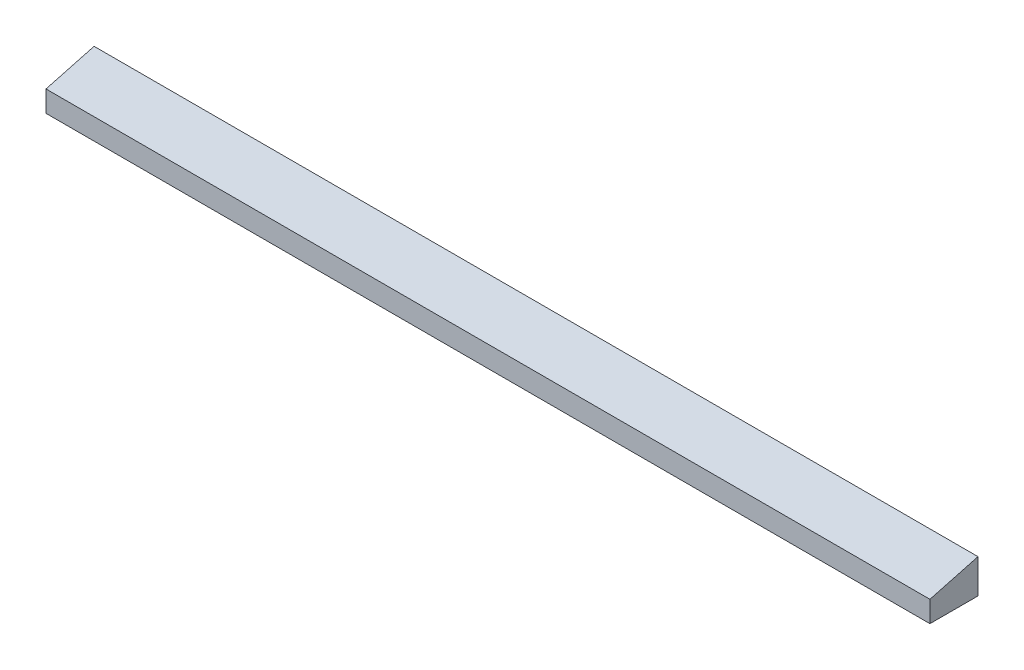
ISO-10303-21;
HEADER;
FILE_DESCRIPTION(('STEP AP214'),'2;1');
FILE_NAME('part.step','',(''),(''),'','','');
FILE_SCHEMA(('AUTOMOTIVE_DESIGN { 1 0 10303 214 1 1 1 1 }'));
ENDSEC;
DATA;
#1=APPLICATION_CONTEXT('core data for automotive mechanical design processes');
#2=APPLICATION_PROTOCOL_DEFINITION('international standard','automotive_design',2000,#1);
#3=PRODUCT_CONTEXT('',#1,'mechanical');
#4=PRODUCT('Part','Part','',(#3));
#5=PRODUCT_RELATED_PRODUCT_CATEGORY('part','',(#4));
#6=PRODUCT_DEFINITION_FORMATION('','',#4);
#7=PRODUCT_DEFINITION_CONTEXT('part definition',#1,'design');
#8=PRODUCT_DEFINITION('design','',#6,#7);
#9=PRODUCT_DEFINITION_SHAPE('','',#8);
#10=(LENGTH_UNIT() NAMED_UNIT(*) SI_UNIT(.MILLI.,.METRE.));
#11=(NAMED_UNIT(*) PLANE_ANGLE_UNIT() SI_UNIT($,.RADIAN.));
#12=(NAMED_UNIT(*) SI_UNIT($,.STERADIAN.) SOLID_ANGLE_UNIT());
#13=UNCERTAINTY_MEASURE_WITH_UNIT(LENGTH_MEASURE(1.E-05),#10,'distance_accuracy_value','');
#14=(GEOMETRIC_REPRESENTATION_CONTEXT(3) GLOBAL_UNCERTAINTY_ASSIGNED_CONTEXT((#13)) GLOBAL_UNIT_ASSIGNED_CONTEXT((#10,
#11,#12)) REPRESENTATION_CONTEXT('',''));
#15=CARTESIAN_POINT('',(0.,0.,0.));
#16=DIRECTION('',(0.,0.,1.));
#17=DIRECTION('',(1.,0.,0.));
#18=AXIS2_PLACEMENT_3D('',#15,#16,#17);
#19=CARTESIAN_POINT('',(-125.,4.99999999999999,13.6));
#20=DIRECTION('',(1.,0.,0.));
#21=DIRECTION('',(0.,0.,-1.));
#22=AXIS2_PLACEMENT_3D('',#19,#20,#21);
#23=PLANE('',#22);
#24=DIRECTION('',(0.,-1.,0.));
#25=VECTOR('',#24,1.);
#26=CARTESIAN_POINT('',(-125.,4.99999999999999,13.6));
#27=LINE('',#26,#25);
#28=CARTESIAN_POINT('',(-125.,0.980762113533023,13.6));
#29=VERTEX_POINT('',#28);
#30=CARTESIAN_POINT('',(-125.,-5.00000000000002,13.6));
#31=VERTEX_POINT('',#30);
#32=EDGE_CURVE('E71',#29,#31,#27,.T.);
#33=ORIENTED_EDGE('',*,*,#32,.F.);
#34=DIRECTION('',(0.,-0.258819045102528,0.965925826289067));
#35=VECTOR('',#34,1.);
#36=CARTESIAN_POINT('',(-125.,0.980762113533024,13.6));
#37=LINE('',#36,#35);
#38=CARTESIAN_POINT('',(-125.,4.62487113059641,0.));
#39=VERTEX_POINT('',#38);
#40=EDGE_CURVE('E54',#29,#39,#37,.F.);
#41=ORIENTED_EDGE('',*,*,#40,.T.);
#42=DIRECTION('',(0.,-1.,0.));
#43=VECTOR('',#42,1.);
#44=CARTESIAN_POINT('',(-125.,4.99999999999999,0.));
#45=LINE('',#44,#43);
#46=CARTESIAN_POINT('',(-125.,-5.00000000000002,0.));
#47=VERTEX_POINT('',#46);
#48=EDGE_CURVE('E91',#39,#47,#45,.T.);
#49=ORIENTED_EDGE('',*,*,#48,.T.);
#50=DIRECTION('',(0.,0.,-1.));
#51=VECTOR('',#50,1.);
#52=CARTESIAN_POINT('',(-125.,-5.00000000000002,13.6));
#53=LINE('',#52,#51);
#54=EDGE_CURVE('E85',#31,#47,#53,.T.);
#55=ORIENTED_EDGE('',*,*,#54,.F.);
#56=EDGE_LOOP('',(#33,#41,#49,#55));
#57=FACE_BOUND('',#56,.T.);
#58=ADVANCED_FACE('F32',(#57),#23,.F.);
#59=CARTESIAN_POINT('',(125.,-4.99999999999999,13.6));
#60=DIRECTION('',(0.,1.,0.));
#61=DIRECTION('',(-1.,0.,0.));
#62=AXIS2_PLACEMENT_3D('',#59,#60,#61);
#63=PLANE('',#62);
#64=DIRECTION('',(1.,0.,0.));
#65=VECTOR('',#64,1.);
#66=CARTESIAN_POINT('',(125.,-4.99999999999999,0.));
#67=LINE('',#66,#65);
#68=CARTESIAN_POINT('',(125.,-4.99999999999999,0.));
#69=VERTEX_POINT('',#68);
#70=EDGE_CURVE('E99',#47,#69,#67,.T.);
#71=ORIENTED_EDGE('',*,*,#70,.T.);
#72=DIRECTION('',(0.,0.,-1.));
#73=VECTOR('',#72,1.);
#74=CARTESIAN_POINT('',(125.,-4.99999999999999,13.6));
#75=LINE('',#74,#73);
#76=CARTESIAN_POINT('',(125.,-4.99999999999999,13.6));
#77=VERTEX_POINT('',#76);
#78=EDGE_CURVE('E87',#77,#69,#75,.T.);
#79=ORIENTED_EDGE('',*,*,#78,.F.);
#80=DIRECTION('',(1.,0.,0.));
#81=VECTOR('',#80,1.);
#82=CARTESIAN_POINT('',(125.,-4.99999999999999,13.6));
#83=LINE('',#82,#81);
#84=EDGE_CURVE('E75',#31,#77,#83,.T.);
#85=ORIENTED_EDGE('',*,*,#84,.F.);
#86=ORIENTED_EDGE('',*,*,#54,.T.);
#87=EDGE_LOOP('',(#71,#79,#85,#86));
#88=FACE_BOUND('',#87,.T.);
#89=ADVANCED_FACE('F84',(#88),#63,.F.);
#90=CARTESIAN_POINT('',(125.,5.00000000000002,13.6));
#91=DIRECTION('',(-1.,0.,0.));
#92=DIRECTION('',(0.,0.,1.));
#93=AXIS2_PLACEMENT_3D('',#90,#91,#92);
#94=PLANE('',#93);
#95=DIRECTION('',(0.,1.,0.));
#96=VECTOR('',#95,1.);
#97=CARTESIAN_POINT('',(125.,5.00000000000002,0.));
#98=LINE('',#97,#96);
#99=CARTESIAN_POINT('',(125.,4.62487113059642,0.));
#100=VERTEX_POINT('',#99);
#101=EDGE_CURVE('E80',#69,#100,#98,.T.);
#102=ORIENTED_EDGE('',*,*,#101,.T.);
#103=DIRECTION('',(0.,0.258819045102528,-0.965925826289067));
#104=VECTOR('',#103,1.);
#105=CARTESIAN_POINT('',(125.,0.980762113533052,13.6));
#106=LINE('',#105,#104);
#107=CARTESIAN_POINT('',(125.,0.980762113533053,13.6));
#108=VERTEX_POINT('',#107);
#109=EDGE_CURVE('E11',#100,#108,#106,.F.);
#110=ORIENTED_EDGE('',*,*,#109,.T.);
#111=DIRECTION('',(0.,1.,0.));
#112=VECTOR('',#111,1.);
#113=CARTESIAN_POINT('',(125.,5.00000000000002,13.6));
#114=LINE('',#113,#112);
#115=EDGE_CURVE('E89',#77,#108,#114,.T.);
#116=ORIENTED_EDGE('',*,*,#115,.F.);
#117=ORIENTED_EDGE('',*,*,#78,.T.);
#118=EDGE_LOOP('',(#102,#110,#116,#117));
#119=FACE_BOUND('',#118,.T.);
#120=ADVANCED_FACE('F105',(#119),#94,.F.);
#121=CARTESIAN_POINT('',(0.,0.,13.6));
#122=DIRECTION('',(0.,0.,-1.));
#123=DIRECTION('',(-1.,0.,0.));
#124=AXIS2_PLACEMENT_3D('',#121,#122,#123);
#125=PLANE('',#124);
#126=ORIENTED_EDGE('',*,*,#115,.T.);
#127=DIRECTION('',(-1.,0.,0.));
#128=VECTOR('',#127,1.);
#129=CARTESIAN_POINT('',(0.,0.980762113533038,13.6));
#130=LINE('',#129,#128);
#131=EDGE_CURVE('E78',#108,#29,#130,.T.);
#132=ORIENTED_EDGE('',*,*,#131,.T.);
#133=ORIENTED_EDGE('',*,*,#32,.T.);
#134=ORIENTED_EDGE('',*,*,#84,.T.);
#135=EDGE_LOOP('',(#126,#132,#133,#134));
#136=FACE_BOUND('',#135,.T.);
#137=ADVANCED_FACE('F74',(#136),#125,.F.);
#138=CARTESIAN_POINT('',(0.,0.,0.));
#139=DIRECTION('',(0.,0.,-1.));
#140=DIRECTION('',(-1.,0.,0.));
#141=AXIS2_PLACEMENT_3D('',#138,#139,#140);
#142=PLANE('',#141);
#143=ORIENTED_EDGE('',*,*,#48,.F.);
#144=DIRECTION('',(-1.,0.,0.));
#145=VECTOR('',#144,1.);
#146=CARTESIAN_POINT('',(0.,4.62487113059641,0.));
#147=LINE('',#146,#145);
#148=EDGE_CURVE('E40',#39,#100,#147,.F.);
#149=ORIENTED_EDGE('',*,*,#148,.T.);
#150=ORIENTED_EDGE('',*,*,#101,.F.);
#151=ORIENTED_EDGE('',*,*,#70,.F.);
#152=EDGE_LOOP('',(#143,#149,#150,#151));
#153=FACE_BOUND('',#152,.T.);
#154=ADVANCED_FACE('F106',(#153),#142,.T.);
#155=CARTESIAN_POINT('',(0.,0.980762113533038,13.6));
#156=DIRECTION('',(0.,-0.965925826289067,-0.258819045102528));
#157=DIRECTION('',(-1.,0.,0.));
#158=AXIS2_PLACEMENT_3D('',#155,#156,#157);
#159=PLANE('',#158);
#160=ORIENTED_EDGE('',*,*,#109,.F.);
#161=ORIENTED_EDGE('',*,*,#148,.F.);
#162=ORIENTED_EDGE('',*,*,#40,.F.);
#163=ORIENTED_EDGE('',*,*,#131,.F.);
#164=EDGE_LOOP('',(#160,#161,#162,#163));
#165=FACE_BOUND('',#164,.T.);
#166=ADVANCED_FACE('F34',(#165),#159,.F.);
#167=CLOSED_SHELL('',(#58,#89,#120,#137,#154,#166));
#168=MANIFOLD_SOLID_BREP('B2',#167);
#169=ADVANCED_BREP_SHAPE_REPRESENTATION('',(#18,#168),#14);
#170=SHAPE_DEFINITION_REPRESENTATION(#9,#169);
ENDSEC;
END-ISO-10303-21;
